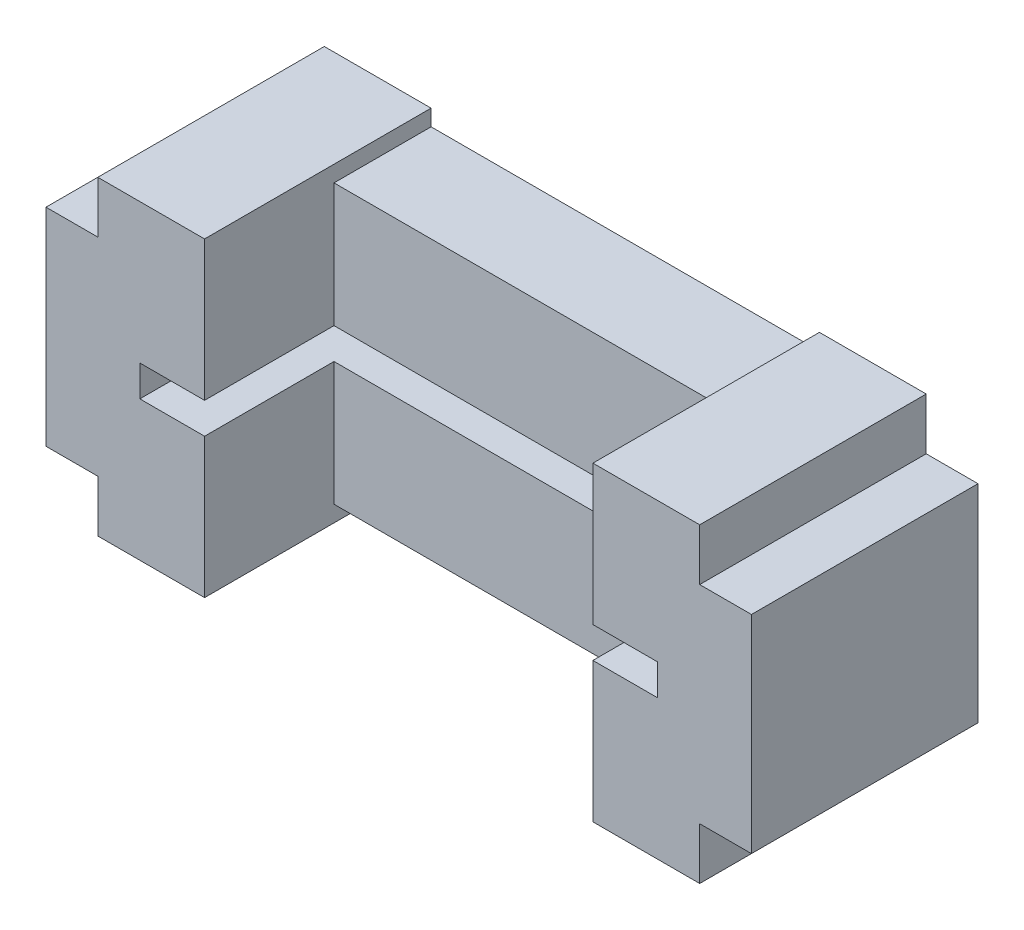
ISO-10303-21;
HEADER;
FILE_DESCRIPTION(('STEP AP214'),'2;1');
FILE_NAME('part.step','',(''),(''),'','','');
FILE_SCHEMA(('AUTOMOTIVE_DESIGN { 1 0 10303 214 1 1 1 1 }'));
ENDSEC;
DATA;
#1=APPLICATION_CONTEXT('core data for automotive mechanical design processes');
#2=APPLICATION_PROTOCOL_DEFINITION('international standard','automotive_design',2000,#1);
#3=PRODUCT_CONTEXT('',#1,'mechanical');
#4=PRODUCT('Part','Part','',(#3));
#5=PRODUCT_RELATED_PRODUCT_CATEGORY('part','',(#4));
#6=PRODUCT_DEFINITION_FORMATION('','',#4);
#7=PRODUCT_DEFINITION_CONTEXT('part definition',#1,'design');
#8=PRODUCT_DEFINITION('design','',#6,#7);
#9=PRODUCT_DEFINITION_SHAPE('','',#8);
#10=(LENGTH_UNIT() NAMED_UNIT(*) SI_UNIT(.MILLI.,.METRE.));
#11=(NAMED_UNIT(*) PLANE_ANGLE_UNIT() SI_UNIT($,.RADIAN.));
#12=(NAMED_UNIT(*) SI_UNIT($,.STERADIAN.) SOLID_ANGLE_UNIT());
#13=UNCERTAINTY_MEASURE_WITH_UNIT(LENGTH_MEASURE(1.E-05),#10,'distance_accuracy_value','');
#14=(GEOMETRIC_REPRESENTATION_CONTEXT(3) GLOBAL_UNCERTAINTY_ASSIGNED_CONTEXT((#13)) GLOBAL_UNIT_ASSIGNED_CONTEXT((#10,
#11,#12)) REPRESENTATION_CONTEXT('',''));
#15=CARTESIAN_POINT('',(0.,0.,0.));
#16=DIRECTION('',(0.,0.,1.));
#17=DIRECTION('',(1.,0.,0.));
#18=AXIS2_PLACEMENT_3D('',#15,#16,#17);
#19=CARTESIAN_POINT('',(-29.5275,-15.24,9.525));
#20=DIRECTION('',(0.,1.,0.));
#21=DIRECTION('',(-1.,0.,0.));
#22=AXIS2_PLACEMENT_3D('',#19,#20,#21);
#23=PLANE('',#22);
#24=DIRECTION('',(1.,0.,0.));
#25=VECTOR('',#24,1.);
#26=CARTESIAN_POINT('',(-29.5275,-15.24,0.));
#27=LINE('',#26,#25);
#28=CARTESIAN_POINT('',(-29.5275,-15.24,0.));
#29=VERTEX_POINT('',#28);
#30=CARTESIAN_POINT('',(-19.05,-15.24,0.));
#31=VERTEX_POINT('',#30);
#32=EDGE_CURVE('E387',#29,#31,#27,.T.);
#33=ORIENTED_EDGE('',*,*,#32,.T.);
#34=DIRECTION('',(0.,0.,-1.));
#35=VECTOR('',#34,1.);
#36=CARTESIAN_POINT('',(-19.05,-15.24,22.225));
#37=LINE('',#36,#35);
#38=CARTESIAN_POINT('',(-19.05,-15.24,22.225));
#39=VERTEX_POINT('',#38);
#40=EDGE_CURVE('E360',#39,#31,#37,.T.);
#41=ORIENTED_EDGE('',*,*,#40,.F.);
#42=DIRECTION('',(1.,0.,0.));
#43=VECTOR('',#42,1.);
#44=CARTESIAN_POINT('',(-29.5275,-15.24,22.225));
#45=LINE('',#44,#43);
#46=CARTESIAN_POINT('',(-29.5275,-15.24,22.225));
#47=VERTEX_POINT('',#46);
#48=EDGE_CURVE('E358',#47,#39,#45,.T.);
#49=ORIENTED_EDGE('',*,*,#48,.F.);
#50=DIRECTION('',(0.,0.,-1.));
#51=VECTOR('',#50,1.);
#52=CARTESIAN_POINT('',(-29.5275,-15.24,9.525));
#53=LINE('',#52,#51);
#54=EDGE_CURVE('E424',#47,#29,#53,.T.);
#55=ORIENTED_EDGE('',*,*,#54,.T.);
#56=EDGE_LOOP('',(#33,#41,#49,#55));
#57=FACE_BOUND('',#56,.T.);
#58=ADVANCED_FACE('F35',(#57),#23,.F.);
#59=CARTESIAN_POINT('',(-29.5275,15.24,9.525));
#60=DIRECTION('',(0.,-1.,0.));
#61=DIRECTION('',(1.,0.,0.));
#62=AXIS2_PLACEMENT_3D('',#59,#60,#61);
#63=PLANE('',#62);
#64=DIRECTION('',(0.,0.,-1.));
#65=VECTOR('',#64,1.);
#66=CARTESIAN_POINT('',(-19.05,15.24,22.225));
#67=LINE('',#66,#65);
#68=CARTESIAN_POINT('',(-19.05,15.24,22.225));
#69=VERTEX_POINT('',#68);
#70=CARTESIAN_POINT('',(-19.05,15.24,0.));
#71=VERTEX_POINT('',#70);
#72=EDGE_CURVE('E364',#69,#71,#67,.T.);
#73=ORIENTED_EDGE('',*,*,#72,.T.);
#74=DIRECTION('',(-1.,0.,0.));
#75=VECTOR('',#74,1.);
#76=CARTESIAN_POINT('',(-29.5275,15.24,0.));
#77=LINE('',#76,#75);
#78=CARTESIAN_POINT('',(-29.5275,15.24,0.));
#79=VERTEX_POINT('',#78);
#80=EDGE_CURVE('E242',#71,#79,#77,.T.);
#81=ORIENTED_EDGE('',*,*,#80,.T.);
#82=DIRECTION('',(0.,0.,-1.));
#83=VECTOR('',#82,1.);
#84=CARTESIAN_POINT('',(-29.5275,15.24,9.525));
#85=LINE('',#84,#83);
#86=CARTESIAN_POINT('',(-29.5275,15.24,22.225));
#87=VERTEX_POINT('',#86);
#88=EDGE_CURVE('E403',#87,#79,#85,.T.);
#89=ORIENTED_EDGE('',*,*,#88,.F.);
#90=DIRECTION('',(-1.,0.,0.));
#91=VECTOR('',#90,1.);
#92=CARTESIAN_POINT('',(-29.5275,15.24,22.225));
#93=LINE('',#92,#91);
#94=EDGE_CURVE('E340',#69,#87,#93,.T.);
#95=ORIENTED_EDGE('',*,*,#94,.F.);
#96=EDGE_LOOP('',(#73,#81,#89,#95));
#97=FACE_BOUND('',#96,.T.);
#98=ADVANCED_FACE('F476',(#97),#63,.F.);
#99=CARTESIAN_POINT('',(0.,0.,9.525));
#100=DIRECTION('',(0.,0.,1.));
#101=DIRECTION('',(1.,0.,0.));
#102=AXIS2_PLACEMENT_3D('',#99,#100,#101);
#103=PLANE('',#102);
#104=DIRECTION('',(1.,0.,0.));
#105=VECTOR('',#104,1.);
#106=CARTESIAN_POINT('',(0.,13.6525,9.525));
#107=LINE('',#106,#105);
#108=CARTESIAN_POINT('',(-19.05,13.6525,9.525));
#109=VERTEX_POINT('',#108);
#110=CARTESIAN_POINT('',(19.05,13.6525,9.525));
#111=VERTEX_POINT('',#110);
#112=EDGE_CURVE('E250',#109,#111,#107,.T.);
#113=ORIENTED_EDGE('',*,*,#112,.F.);
#114=DIRECTION('',(0.,1.,0.));
#115=VECTOR('',#114,1.);
#116=CARTESIAN_POINT('',(-19.05,15.24,9.525));
#117=LINE('',#116,#115);
#118=CARTESIAN_POINT('',(-19.05,1.524,9.525));
#119=VERTEX_POINT('',#118);
#120=EDGE_CURVE('E230',#119,#109,#117,.T.);
#121=ORIENTED_EDGE('',*,*,#120,.F.);
#122=DIRECTION('',(-1.,0.,0.));
#123=VECTOR('',#122,1.);
#124=CARTESIAN_POINT('',(-25.4,1.524,9.525));
#125=LINE('',#124,#123);
#126=CARTESIAN_POINT('',(19.05,1.524,9.525));
#127=VERTEX_POINT('',#126);
#128=EDGE_CURVE('E268',#127,#119,#125,.T.);
#129=ORIENTED_EDGE('',*,*,#128,.F.);
#130=DIRECTION('',(0.,-1.,0.));
#131=VECTOR('',#130,1.);
#132=CARTESIAN_POINT('',(19.05,15.24,9.525));
#133=LINE('',#132,#131);
#134=EDGE_CURVE('E284',#111,#127,#133,.T.);
#135=ORIENTED_EDGE('',*,*,#134,.F.);
#136=EDGE_LOOP('',(#113,#121,#129,#135));
#137=FACE_BOUND('',#136,.T.);
#138=ADVANCED_FACE('F493',(#137),#103,.T.);
#139=DIRECTION('',(-1.,0.,0.));
#140=VECTOR('',#139,1.);
#141=CARTESIAN_POINT('',(0.,-13.6525,9.525));
#142=LINE('',#141,#140);
#143=CARTESIAN_POINT('',(19.05,-13.6525,9.525));
#144=VERTEX_POINT('',#143);
#145=CARTESIAN_POINT('',(-19.05,-13.6525,9.525));
#146=VERTEX_POINT('',#145);
#147=EDGE_CURVE('E261',#144,#146,#142,.T.);
#148=ORIENTED_EDGE('',*,*,#147,.F.);
#149=DIRECTION('',(0.,-1.,0.));
#150=VECTOR('',#149,1.);
#151=CARTESIAN_POINT('',(19.05,-1.524,9.525));
#152=LINE('',#151,#150);
#153=CARTESIAN_POINT('',(19.05,-1.524,9.525));
#154=VERTEX_POINT('',#153);
#155=EDGE_CURVE('E277',#154,#144,#152,.T.);
#156=ORIENTED_EDGE('',*,*,#155,.F.);
#157=DIRECTION('',(1.,0.,0.));
#158=VECTOR('',#157,1.);
#159=CARTESIAN_POINT('',(-25.4,-1.524,9.525));
#160=LINE('',#159,#158);
#161=CARTESIAN_POINT('',(-19.05,-1.524,9.525));
#162=VERTEX_POINT('',#161);
#163=EDGE_CURVE('E263',#162,#154,#160,.T.);
#164=ORIENTED_EDGE('',*,*,#163,.F.);
#165=DIRECTION('',(0.,1.,0.));
#166=VECTOR('',#165,1.);
#167=CARTESIAN_POINT('',(-19.05,-1.524,9.525));
#168=LINE('',#167,#166);
#169=EDGE_CURVE('E329',#146,#162,#168,.T.);
#170=ORIENTED_EDGE('',*,*,#169,.F.);
#171=EDGE_LOOP('',(#148,#156,#164,#170));
#172=FACE_BOUND('',#171,.T.);
#173=ADVANCED_FACE('F486',(#172),#103,.T.);
#174=CARTESIAN_POINT('',(-29.5275,15.24,9.525));
#175=DIRECTION('',(1.,0.,0.));
#176=DIRECTION('',(0.,0.,-1.));
#177=AXIS2_PLACEMENT_3D('',#174,#175,#176);
#178=PLANE('',#177);
#179=DIRECTION('',(0.,-1.,0.));
#180=VECTOR('',#179,1.);
#181=CARTESIAN_POINT('',(-29.5275,15.24,0.));
#182=LINE('',#181,#180);
#183=CARTESIAN_POINT('',(-29.5275,10.16,0.));
#184=VERTEX_POINT('',#183);
#185=EDGE_CURVE('E375',#79,#184,#182,.T.);
#186=ORIENTED_EDGE('',*,*,#185,.T.);
#187=DIRECTION('',(0.,0.,-1.));
#188=VECTOR('',#187,1.);
#189=CARTESIAN_POINT('',(-29.5275,10.16,9.525));
#190=LINE('',#189,#188);
#191=CARTESIAN_POINT('',(-29.5275,10.16,22.225));
#192=VERTEX_POINT('',#191);
#193=EDGE_CURVE('E11',#192,#184,#190,.T.);
#194=ORIENTED_EDGE('',*,*,#193,.F.);
#195=DIRECTION('',(0.,-1.,0.));
#196=VECTOR('',#195,1.);
#197=CARTESIAN_POINT('',(-29.5275,15.24,22.225));
#198=LINE('',#197,#196);
#199=EDGE_CURVE('E343',#87,#192,#198,.T.);
#200=ORIENTED_EDGE('',*,*,#199,.F.);
#201=ORIENTED_EDGE('',*,*,#88,.T.);
#202=EDGE_LOOP('',(#186,#194,#200,#201));
#203=FACE_BOUND('',#202,.T.);
#204=ADVANCED_FACE('F37',(#203),#178,.F.);
#205=CARTESIAN_POINT('',(-34.6075,10.16,9.525));
#206=DIRECTION('',(0.,-1.,0.));
#207=DIRECTION('',(0.,0.,-1.));
#208=AXIS2_PLACEMENT_3D('',#205,#206,#207);
#209=PLANE('',#208);
#210=DIRECTION('',(-1.,0.,0.));
#211=VECTOR('',#210,1.);
#212=CARTESIAN_POINT('',(-34.6075,10.16,0.));
#213=LINE('',#212,#211);
#214=CARTESIAN_POINT('',(-34.6075,10.16,0.));
#215=VERTEX_POINT('',#214);
#216=EDGE_CURVE('E378',#184,#215,#213,.T.);
#217=ORIENTED_EDGE('',*,*,#216,.T.);
#218=DIRECTION('',(0.,0.,-1.));
#219=VECTOR('',#218,1.);
#220=CARTESIAN_POINT('',(-34.6075,10.16,9.525));
#221=LINE('',#220,#219);
#222=CARTESIAN_POINT('',(-34.6075,10.16,22.225));
#223=VERTEX_POINT('',#222);
#224=EDGE_CURVE('E43',#223,#215,#221,.T.);
#225=ORIENTED_EDGE('',*,*,#224,.F.);
#226=DIRECTION('',(-1.,0.,0.));
#227=VECTOR('',#226,1.);
#228=CARTESIAN_POINT('',(-34.6075,10.16,22.225));
#229=LINE('',#228,#227);
#230=EDGE_CURVE('E346',#192,#223,#229,.T.);
#231=ORIENTED_EDGE('',*,*,#230,.F.);
#232=ORIENTED_EDGE('',*,*,#193,.T.);
#233=EDGE_LOOP('',(#217,#225,#231,#232));
#234=FACE_BOUND('',#233,.T.);
#235=ADVANCED_FACE('F479',(#234),#209,.F.);
#236=CARTESIAN_POINT('',(-34.6075,-10.16,9.525));
#237=DIRECTION('',(1.,0.,0.));
#238=DIRECTION('',(0.,1.,0.));
#239=AXIS2_PLACEMENT_3D('',#236,#237,#238);
#240=PLANE('',#239);
#241=DIRECTION('',(0.,-1.,0.));
#242=VECTOR('',#241,1.);
#243=CARTESIAN_POINT('',(-34.6075,-10.16,0.));
#244=LINE('',#243,#242);
#245=CARTESIAN_POINT('',(-34.6075,-10.16,0.));
#246=VERTEX_POINT('',#245);
#247=EDGE_CURVE('E380',#215,#246,#244,.T.);
#248=ORIENTED_EDGE('',*,*,#247,.T.);
#249=DIRECTION('',(0.,0.,-1.));
#250=VECTOR('',#249,1.);
#251=CARTESIAN_POINT('',(-34.6075,-10.16,9.525));
#252=LINE('',#251,#250);
#253=CARTESIAN_POINT('',(-34.6075,-10.16,22.225));
#254=VERTEX_POINT('',#253);
#255=EDGE_CURVE('E430',#254,#246,#252,.T.);
#256=ORIENTED_EDGE('',*,*,#255,.F.);
#257=DIRECTION('',(0.,-1.,0.));
#258=VECTOR('',#257,1.);
#259=CARTESIAN_POINT('',(-34.6075,10.16,22.225));
#260=LINE('',#259,#258);
#261=EDGE_CURVE('E349',#223,#254,#260,.T.);
#262=ORIENTED_EDGE('',*,*,#261,.F.);
#263=ORIENTED_EDGE('',*,*,#224,.T.);
#264=EDGE_LOOP('',(#248,#256,#262,#263));
#265=FACE_BOUND('',#264,.T.);
#266=ADVANCED_FACE('F436',(#265),#240,.F.);
#267=CARTESIAN_POINT('',(-34.6075,-10.16,9.525));
#268=DIRECTION('',(0.,1.,0.));
#269=DIRECTION('',(0.,0.,1.));
#270=AXIS2_PLACEMENT_3D('',#267,#268,#269);
#271=PLANE('',#270);
#272=DIRECTION('',(1.,0.,0.));
#273=VECTOR('',#272,1.);
#274=CARTESIAN_POINT('',(-34.6075,-10.16,0.));
#275=LINE('',#274,#273);
#276=CARTESIAN_POINT('',(-29.5275,-10.16,0.));
#277=VERTEX_POINT('',#276);
#278=EDGE_CURVE('E382',#246,#277,#275,.T.);
#279=ORIENTED_EDGE('',*,*,#278,.T.);
#280=DIRECTION('',(0.,0.,-1.));
#281=VECTOR('',#280,1.);
#282=CARTESIAN_POINT('',(-29.5275,-10.16,9.525));
#283=LINE('',#282,#281);
#284=CARTESIAN_POINT('',(-29.5275,-10.16,22.225));
#285=VERTEX_POINT('',#284);
#286=EDGE_CURVE('E427',#285,#277,#283,.T.);
#287=ORIENTED_EDGE('',*,*,#286,.F.);
#288=DIRECTION('',(1.,0.,0.));
#289=VECTOR('',#288,1.);
#290=CARTESIAN_POINT('',(-29.5275,-10.16,22.225));
#291=LINE('',#290,#289);
#292=EDGE_CURVE('E352',#254,#285,#291,.T.);
#293=ORIENTED_EDGE('',*,*,#292,.F.);
#294=ORIENTED_EDGE('',*,*,#255,.T.);
#295=EDGE_LOOP('',(#279,#287,#293,#294));
#296=FACE_BOUND('',#295,.T.);
#297=ADVANCED_FACE('F443',(#296),#271,.F.);
#298=CARTESIAN_POINT('',(-29.5275,-15.24,9.525));
#299=DIRECTION('',(1.,0.,0.));
#300=DIRECTION('',(0.,0.,-1.));
#301=AXIS2_PLACEMENT_3D('',#298,#299,#300);
#302=PLANE('',#301);
#303=DIRECTION('',(0.,-1.,0.));
#304=VECTOR('',#303,1.);
#305=CARTESIAN_POINT('',(-29.5275,-15.24,0.));
#306=LINE('',#305,#304);
#307=EDGE_CURVE('E384',#277,#29,#306,.T.);
#308=ORIENTED_EDGE('',*,*,#307,.T.);
#309=ORIENTED_EDGE('',*,*,#54,.F.);
#310=DIRECTION('',(0.,-1.,0.));
#311=VECTOR('',#310,1.);
#312=CARTESIAN_POINT('',(-29.5275,-10.16,22.225));
#313=LINE('',#312,#311);
#314=EDGE_CURVE('E355',#285,#47,#313,.T.);
#315=ORIENTED_EDGE('',*,*,#314,.F.);
#316=ORIENTED_EDGE('',*,*,#286,.T.);
#317=EDGE_LOOP('',(#308,#309,#315,#316));
#318=FACE_BOUND('',#317,.T.);
#319=ADVANCED_FACE('F447',(#318),#302,.F.);
#320=DIRECTION('',(0.,0.,-1.));
#321=VECTOR('',#320,1.);
#322=CARTESIAN_POINT('',(19.05,-15.24,22.225));
#323=LINE('',#322,#321);
#324=CARTESIAN_POINT('',(19.05,-15.24,22.225));
#325=VERTEX_POINT('',#324);
#326=CARTESIAN_POINT('',(19.05,-15.24,0.));
#327=VERTEX_POINT('',#326);
#328=EDGE_CURVE('E324',#325,#327,#323,.T.);
#329=ORIENTED_EDGE('',*,*,#328,.T.);
#330=CARTESIAN_POINT('',(29.5275,-15.24,0.));
#331=VERTEX_POINT('',#330);
#332=EDGE_CURVE('E386',#327,#331,#27,.T.);
#333=ORIENTED_EDGE('',*,*,#332,.T.);
#334=DIRECTION('',(0.,0.,-1.));
#335=VECTOR('',#334,1.);
#336=CARTESIAN_POINT('',(29.5275,-15.24,9.525));
#337=LINE('',#336,#335);
#338=CARTESIAN_POINT('',(29.5275,-15.24,22.225));
#339=VERTEX_POINT('',#338);
#340=EDGE_CURVE('E421',#339,#331,#337,.T.);
#341=ORIENTED_EDGE('',*,*,#340,.F.);
#342=DIRECTION('',(1.,0.,0.));
#343=VECTOR('',#342,1.);
#344=CARTESIAN_POINT('',(29.5275,-15.24,22.225));
#345=LINE('',#344,#343);
#346=EDGE_CURVE('E286',#325,#339,#345,.T.);
#347=ORIENTED_EDGE('',*,*,#346,.F.);
#348=EDGE_LOOP('',(#329,#333,#341,#347));
#349=FACE_BOUND('',#348,.T.);
#350=ADVANCED_FACE('F489',(#349),#23,.F.);
#351=CARTESIAN_POINT('',(29.5275,-15.24,9.525));
#352=DIRECTION('',(-1.,0.,0.));
#353=DIRECTION('',(0.,0.,1.));
#354=AXIS2_PLACEMENT_3D('',#351,#352,#353);
#355=PLANE('',#354);
#356=DIRECTION('',(0.,1.,0.));
#357=VECTOR('',#356,1.);
#358=CARTESIAN_POINT('',(29.5275,-15.24,0.));
#359=LINE('',#358,#357);
#360=CARTESIAN_POINT('',(29.5275,-10.16,0.));
#361=VERTEX_POINT('',#360);
#362=EDGE_CURVE('E390',#331,#361,#359,.T.);
#363=ORIENTED_EDGE('',*,*,#362,.T.);
#364=DIRECTION('',(0.,0.,-1.));
#365=VECTOR('',#364,1.);
#366=CARTESIAN_POINT('',(29.5275,-10.16,9.525));
#367=LINE('',#366,#365);
#368=CARTESIAN_POINT('',(29.5275,-10.16,22.225));
#369=VERTEX_POINT('',#368);
#370=EDGE_CURVE('E418',#369,#361,#367,.T.);
#371=ORIENTED_EDGE('',*,*,#370,.F.);
#372=DIRECTION('',(0.,1.,0.));
#373=VECTOR('',#372,1.);
#374=CARTESIAN_POINT('',(29.5275,-15.24,22.225));
#375=LINE('',#374,#373);
#376=EDGE_CURVE('E289',#339,#369,#375,.T.);
#377=ORIENTED_EDGE('',*,*,#376,.F.);
#378=ORIENTED_EDGE('',*,*,#340,.T.);
#379=EDGE_LOOP('',(#363,#371,#377,#378));
#380=FACE_BOUND('',#379,.T.);
#381=ADVANCED_FACE('F499',(#380),#355,.F.);
#382=CARTESIAN_POINT('',(34.6075,-10.16,9.525));
#383=DIRECTION('',(0.,1.,0.));
#384=DIRECTION('',(0.,0.,1.));
#385=AXIS2_PLACEMENT_3D('',#382,#383,#384);
#386=PLANE('',#385);
#387=DIRECTION('',(1.,0.,0.));
#388=VECTOR('',#387,1.);
#389=CARTESIAN_POINT('',(34.6075,-10.16,0.));
#390=LINE('',#389,#388);
#391=CARTESIAN_POINT('',(34.6075,-10.16,0.));
#392=VERTEX_POINT('',#391);
#393=EDGE_CURVE('E392',#361,#392,#390,.T.);
#394=ORIENTED_EDGE('',*,*,#393,.T.);
#395=DIRECTION('',(0.,0.,-1.));
#396=VECTOR('',#395,1.);
#397=CARTESIAN_POINT('',(34.6075,-10.16,9.525));
#398=LINE('',#397,#396);
#399=CARTESIAN_POINT('',(34.6075,-10.16,22.225));
#400=VERTEX_POINT('',#399);
#401=EDGE_CURVE('E415',#400,#392,#398,.T.);
#402=ORIENTED_EDGE('',*,*,#401,.F.);
#403=DIRECTION('',(1.,0.,0.));
#404=VECTOR('',#403,1.);
#405=CARTESIAN_POINT('',(34.6075,-10.16,22.225));
#406=LINE('',#405,#404);
#407=EDGE_CURVE('E292',#369,#400,#406,.T.);
#408=ORIENTED_EDGE('',*,*,#407,.F.);
#409=ORIENTED_EDGE('',*,*,#370,.T.);
#410=EDGE_LOOP('',(#394,#402,#408,#409));
#411=FACE_BOUND('',#410,.T.);
#412=ADVANCED_FACE('F505',(#411),#386,.F.);
#413=CARTESIAN_POINT('',(34.6075,-10.16,9.525));
#414=DIRECTION('',(-1.,0.,0.));
#415=DIRECTION('',(0.,-1.,0.));
#416=AXIS2_PLACEMENT_3D('',#413,#414,#415);
#417=PLANE('',#416);
#418=DIRECTION('',(0.,1.,0.));
#419=VECTOR('',#418,1.);
#420=CARTESIAN_POINT('',(34.6075,-10.16,0.));
#421=LINE('',#420,#419);
#422=CARTESIAN_POINT('',(34.6075,10.16,0.));
#423=VERTEX_POINT('',#422);
#424=EDGE_CURVE('E394',#392,#423,#421,.T.);
#425=ORIENTED_EDGE('',*,*,#424,.T.);
#426=DIRECTION('',(0.,0.,-1.));
#427=VECTOR('',#426,1.);
#428=CARTESIAN_POINT('',(34.6075,10.16,9.525));
#429=LINE('',#428,#427);
#430=CARTESIAN_POINT('',(34.6075,10.16,22.225));
#431=VERTEX_POINT('',#430);
#432=EDGE_CURVE('E412',#431,#423,#429,.T.);
#433=ORIENTED_EDGE('',*,*,#432,.F.);
#434=DIRECTION('',(0.,1.,0.));
#435=VECTOR('',#434,1.);
#436=CARTESIAN_POINT('',(34.6075,10.16,22.225));
#437=LINE('',#436,#435);
#438=EDGE_CURVE('E295',#400,#431,#437,.T.);
#439=ORIENTED_EDGE('',*,*,#438,.F.);
#440=ORIENTED_EDGE('',*,*,#401,.T.);
#441=EDGE_LOOP('',(#425,#433,#439,#440));
#442=FACE_BOUND('',#441,.T.);
#443=ADVANCED_FACE('F524',(#442),#417,.F.);
#444=CARTESIAN_POINT('',(34.6075,10.16,9.525));
#445=DIRECTION('',(0.,-1.,0.));
#446=DIRECTION('',(0.,0.,-1.));
#447=AXIS2_PLACEMENT_3D('',#444,#445,#446);
#448=PLANE('',#447);
#449=DIRECTION('',(-1.,0.,0.));
#450=VECTOR('',#449,1.);
#451=CARTESIAN_POINT('',(34.6075,10.16,0.));
#452=LINE('',#451,#450);
#453=CARTESIAN_POINT('',(29.5275,10.16,0.));
#454=VERTEX_POINT('',#453);
#455=EDGE_CURVE('E396',#423,#454,#452,.T.);
#456=ORIENTED_EDGE('',*,*,#455,.T.);
#457=DIRECTION('',(0.,0.,-1.));
#458=VECTOR('',#457,1.);
#459=CARTESIAN_POINT('',(29.5275,10.16,9.525));
#460=LINE('',#459,#458);
#461=CARTESIAN_POINT('',(29.5275,10.16,22.225));
#462=VERTEX_POINT('',#461);
#463=EDGE_CURVE('E409',#462,#454,#460,.T.);
#464=ORIENTED_EDGE('',*,*,#463,.F.);
#465=DIRECTION('',(-1.,0.,0.));
#466=VECTOR('',#465,1.);
#467=CARTESIAN_POINT('',(34.6075,10.16,22.225));
#468=LINE('',#467,#466);
#469=EDGE_CURVE('E298',#431,#462,#468,.T.);
#470=ORIENTED_EDGE('',*,*,#469,.F.);
#471=ORIENTED_EDGE('',*,*,#432,.T.);
#472=EDGE_LOOP('',(#456,#464,#470,#471));
#473=FACE_BOUND('',#472,.T.);
#474=ADVANCED_FACE('F527',(#473),#448,.F.);
#475=CARTESIAN_POINT('',(29.5275,15.24,9.525));
#476=DIRECTION('',(-1.,0.,0.));
#477=DIRECTION('',(0.,0.,1.));
#478=AXIS2_PLACEMENT_3D('',#475,#476,#477);
#479=PLANE('',#478);
#480=DIRECTION('',(0.,1.,0.));
#481=VECTOR('',#480,1.);
#482=CARTESIAN_POINT('',(29.5275,15.24,0.));
#483=LINE('',#482,#481);
#484=CARTESIAN_POINT('',(29.5275,15.24,0.));
#485=VERTEX_POINT('',#484);
#486=EDGE_CURVE('E398',#454,#485,#483,.T.);
#487=ORIENTED_EDGE('',*,*,#486,.T.);
#488=DIRECTION('',(0.,0.,-1.));
#489=VECTOR('',#488,1.);
#490=CARTESIAN_POINT('',(29.5275,15.24,9.525));
#491=LINE('',#490,#489);
#492=CARTESIAN_POINT('',(29.5275,15.24,22.225));
#493=VERTEX_POINT('',#492);
#494=EDGE_CURVE('E406',#493,#485,#491,.T.);
#495=ORIENTED_EDGE('',*,*,#494,.F.);
#496=DIRECTION('',(0.,1.,0.));
#497=VECTOR('',#496,1.);
#498=CARTESIAN_POINT('',(29.5275,15.24,22.225));
#499=LINE('',#498,#497);
#500=EDGE_CURVE('E301',#462,#493,#499,.T.);
#501=ORIENTED_EDGE('',*,*,#500,.F.);
#502=ORIENTED_EDGE('',*,*,#463,.T.);
#503=EDGE_LOOP('',(#487,#495,#501,#502));
#504=FACE_BOUND('',#503,.T.);
#505=ADVANCED_FACE('F531',(#504),#479,.F.);
#506=CARTESIAN_POINT('',(19.05,15.24,0.));
#507=VERTEX_POINT('',#506);
#508=EDGE_CURVE('E400',#485,#507,#77,.T.);
#509=ORIENTED_EDGE('',*,*,#508,.T.);
#510=DIRECTION('',(0.,0.,-1.));
#511=VECTOR('',#510,1.);
#512=CARTESIAN_POINT('',(19.05,15.24,22.225));
#513=LINE('',#512,#511);
#514=CARTESIAN_POINT('',(19.05,15.24,22.225));
#515=VERTEX_POINT('',#514);
#516=EDGE_CURVE('E322',#515,#507,#513,.T.);
#517=ORIENTED_EDGE('',*,*,#516,.F.);
#518=DIRECTION('',(-1.,0.,0.));
#519=VECTOR('',#518,1.);
#520=CARTESIAN_POINT('',(29.5275,15.24,22.225));
#521=LINE('',#520,#519);
#522=EDGE_CURVE('E304',#493,#515,#521,.T.);
#523=ORIENTED_EDGE('',*,*,#522,.F.);
#524=ORIENTED_EDGE('',*,*,#494,.T.);
#525=EDGE_LOOP('',(#509,#517,#523,#524));
#526=FACE_BOUND('',#525,.T.);
#527=ADVANCED_FACE('F495',(#526),#63,.F.);
#528=CARTESIAN_POINT('',(0.,0.,0.));
#529=DIRECTION('',(0.,0.,1.));
#530=DIRECTION('',(1.,0.,0.));
#531=AXIS2_PLACEMENT_3D('',#528,#529,#530);
#532=PLANE('',#531);
#533=ORIENTED_EDGE('',*,*,#80,.F.);
#534=DIRECTION('',(0.,-1.,0.));
#535=VECTOR('',#534,1.);
#536=CARTESIAN_POINT('',(-19.05,15.24,0.));
#537=LINE('',#536,#535);
#538=CARTESIAN_POINT('',(-19.05,13.6525,0.));
#539=VERTEX_POINT('',#538);
#540=EDGE_CURVE('E226',#71,#539,#537,.T.);
#541=ORIENTED_EDGE('',*,*,#540,.T.);
#542=DIRECTION('',(1.,0.,0.));
#543=VECTOR('',#542,1.);
#544=CARTESIAN_POINT('',(-19.05,13.6525,0.));
#545=LINE('',#544,#543);
#546=CARTESIAN_POINT('',(19.05,13.6525,0.));
#547=VERTEX_POINT('',#546);
#548=EDGE_CURVE('E236',#539,#547,#545,.T.);
#549=ORIENTED_EDGE('',*,*,#548,.T.);
#550=DIRECTION('',(0.,1.,0.));
#551=VECTOR('',#550,1.);
#552=CARTESIAN_POINT('',(19.05,15.24,0.));
#553=LINE('',#552,#551);
#554=EDGE_CURVE('E50',#547,#507,#553,.T.);
#555=ORIENTED_EDGE('',*,*,#554,.T.);
#556=ORIENTED_EDGE('',*,*,#508,.F.);
#557=ORIENTED_EDGE('',*,*,#486,.F.);
#558=ORIENTED_EDGE('',*,*,#455,.F.);
#559=ORIENTED_EDGE('',*,*,#424,.F.);
#560=ORIENTED_EDGE('',*,*,#393,.F.);
#561=ORIENTED_EDGE('',*,*,#362,.F.);
#562=ORIENTED_EDGE('',*,*,#332,.F.);
#563=DIRECTION('',(0.,1.,0.));
#564=VECTOR('',#563,1.);
#565=CARTESIAN_POINT('',(19.05,-15.24,0.));
#566=LINE('',#565,#564);
#567=CARTESIAN_POINT('',(19.05,-13.6525,0.));
#568=VERTEX_POINT('',#567);
#569=EDGE_CURVE('E252',#327,#568,#566,.T.);
#570=ORIENTED_EDGE('',*,*,#569,.T.);
#571=DIRECTION('',(-1.,0.,0.));
#572=VECTOR('',#571,1.);
#573=CARTESIAN_POINT('',(-19.05,-13.6525,0.));
#574=LINE('',#573,#572);
#575=CARTESIAN_POINT('',(-19.05,-13.6525,0.));
#576=VERTEX_POINT('',#575);
#577=EDGE_CURVE('E58',#568,#576,#574,.T.);
#578=ORIENTED_EDGE('',*,*,#577,.T.);
#579=DIRECTION('',(0.,-1.,0.));
#580=VECTOR('',#579,1.);
#581=CARTESIAN_POINT('',(-19.05,-15.24,0.));
#582=LINE('',#581,#580);
#583=EDGE_CURVE('E256',#576,#31,#582,.T.);
#584=ORIENTED_EDGE('',*,*,#583,.T.);
#585=ORIENTED_EDGE('',*,*,#32,.F.);
#586=ORIENTED_EDGE('',*,*,#307,.F.);
#587=ORIENTED_EDGE('',*,*,#278,.F.);
#588=ORIENTED_EDGE('',*,*,#247,.F.);
#589=ORIENTED_EDGE('',*,*,#216,.F.);
#590=ORIENTED_EDGE('',*,*,#185,.F.);
#591=EDGE_LOOP('',(#533,#541,#549,#555,#556,#557,#558,#559,#560,#561,#562,#570,#578,#584,#585,
#586,#587,#588,#589,#590));
#592=FACE_BOUND('',#591,.T.);
#593=ADVANCED_FACE('F240',(#592),#532,.F.);
#594=CARTESIAN_POINT('',(-19.05,-1.524,22.225));
#595=DIRECTION('',(-1.,0.,0.));
#596=DIRECTION('',(0.,-1.,0.));
#597=AXIS2_PLACEMENT_3D('',#594,#595,#596);
#598=PLANE('',#597);
#599=DIRECTION('',(0.,0.,-1.));
#600=VECTOR('',#599,1.);
#601=CARTESIAN_POINT('',(-19.05,-1.524,22.225));
#602=LINE('',#601,#600);
#603=CARTESIAN_POINT('',(-19.05,-1.524,22.225));
#604=VERTEX_POINT('',#603);
#605=EDGE_CURVE('E372',#604,#162,#602,.T.);
#606=ORIENTED_EDGE('',*,*,#605,.F.);
#607=DIRECTION('',(0.,1.,0.));
#608=VECTOR('',#607,1.);
#609=CARTESIAN_POINT('',(-19.05,-1.524,22.225));
#610=LINE('',#609,#608);
#611=EDGE_CURVE('E330',#39,#604,#610,.T.);
#612=ORIENTED_EDGE('',*,*,#611,.F.);
#613=ORIENTED_EDGE('',*,*,#40,.T.);
#614=ORIENTED_EDGE('',*,*,#583,.F.);
#615=DIRECTION('',(0.,0.,1.));
#616=VECTOR('',#615,1.);
#617=CARTESIAN_POINT('',(-19.05,-13.6525,0.));
#618=LINE('',#617,#616);
#619=EDGE_CURVE('E243',#576,#146,#618,.T.);
#620=ORIENTED_EDGE('',*,*,#619,.T.);
#621=ORIENTED_EDGE('',*,*,#169,.T.);
#622=EDGE_LOOP('',(#606,#612,#613,#614,#620,#621));
#623=FACE_BOUND('',#622,.T.);
#624=ADVANCED_FACE('F457',(#623),#598,.F.);
#625=CARTESIAN_POINT('',(-19.05,-1.524,22.225));
#626=DIRECTION('',(0.,-1.,0.));
#627=DIRECTION('',(1.,0.,0.));
#628=AXIS2_PLACEMENT_3D('',#625,#626,#627);
#629=PLANE('',#628);
#630=ORIENTED_EDGE('',*,*,#605,.T.);
#631=ORIENTED_EDGE('',*,*,#163,.T.);
#632=DIRECTION('',(0.,0.,-1.));
#633=VECTOR('',#632,1.);
#634=CARTESIAN_POINT('',(19.05,-1.524,22.225));
#635=LINE('',#634,#633);
#636=CARTESIAN_POINT('',(19.05,-1.524,22.225));
#637=VERTEX_POINT('',#636);
#638=EDGE_CURVE('E326',#637,#154,#635,.T.);
#639=ORIENTED_EDGE('',*,*,#638,.F.);
#640=DIRECTION('',(-1.,0.,0.));
#641=VECTOR('',#640,1.);
#642=CARTESIAN_POINT('',(19.05,-1.524,22.225));
#643=LINE('',#642,#641);
#644=CARTESIAN_POINT('',(25.4,-1.524,22.225));
#645=VERTEX_POINT('',#644);
#646=EDGE_CURVE('E280',#645,#637,#643,.T.);
#647=ORIENTED_EDGE('',*,*,#646,.F.);
#648=DIRECTION('',(0.,0.,-1.));
#649=VECTOR('',#648,1.);
#650=CARTESIAN_POINT('',(25.4,-1.524,22.225));
#651=LINE('',#650,#649);
#652=CARTESIAN_POINT('',(25.4,-1.524,3.429));
#653=VERTEX_POINT('',#652);
#654=EDGE_CURVE('E312',#645,#653,#651,.T.);
#655=ORIENTED_EDGE('',*,*,#654,.T.);
#656=DIRECTION('',(1.,0.,0.));
#657=VECTOR('',#656,1.);
#658=CARTESIAN_POINT('',(-25.4,-1.524,3.429));
#659=LINE('',#658,#657);
#660=CARTESIAN_POINT('',(-25.4,-1.524,3.429));
#661=VERTEX_POINT('',#660);
#662=EDGE_CURVE('E267',#661,#653,#659,.T.);
#663=ORIENTED_EDGE('',*,*,#662,.F.);
#664=DIRECTION('',(0.,0.,-1.));
#665=VECTOR('',#664,1.);
#666=CARTESIAN_POINT('',(-25.4,-1.524,22.225));
#667=LINE('',#666,#665);
#668=CARTESIAN_POINT('',(-25.4,-1.524,22.225));
#669=VERTEX_POINT('',#668);
#670=EDGE_CURVE('E370',#669,#661,#667,.T.);
#671=ORIENTED_EDGE('',*,*,#670,.F.);
#672=DIRECTION('',(-1.,0.,0.));
#673=VECTOR('',#672,1.);
#674=CARTESIAN_POINT('',(-19.05,-1.524,22.225));
#675=LINE('',#674,#673);
#676=EDGE_CURVE('E332',#604,#669,#675,.T.);
#677=ORIENTED_EDGE('',*,*,#676,.F.);
#678=EDGE_LOOP('',(#630,#631,#639,#647,#655,#663,#671,#677));
#679=FACE_BOUND('',#678,.T.);
#680=ADVANCED_FACE('F461',(#679),#629,.F.);
#681=CARTESIAN_POINT('',(-25.4,1.524,22.225));
#682=DIRECTION('',(-1.,0.,0.));
#683=DIRECTION('',(0.,0.,1.));
#684=AXIS2_PLACEMENT_3D('',#681,#682,#683);
#685=PLANE('',#684);
#686=ORIENTED_EDGE('',*,*,#670,.T.);
#687=DIRECTION('',(0.,-1.,0.));
#688=VECTOR('',#687,1.);
#689=CARTESIAN_POINT('',(-25.4,-1.524,3.429));
#690=LINE('',#689,#688);
#691=CARTESIAN_POINT('',(-25.4,1.524,3.429));
#692=VERTEX_POINT('',#691);
#693=EDGE_CURVE('E264',#692,#661,#690,.T.);
#694=ORIENTED_EDGE('',*,*,#693,.F.);
#695=DIRECTION('',(0.,0.,-1.));
#696=VECTOR('',#695,1.);
#697=CARTESIAN_POINT('',(-25.4,1.524,22.225));
#698=LINE('',#697,#696);
#699=CARTESIAN_POINT('',(-25.4,1.524,22.225));
#700=VERTEX_POINT('',#699);
#701=EDGE_CURVE('E368',#700,#692,#698,.T.);
#702=ORIENTED_EDGE('',*,*,#701,.F.);
#703=DIRECTION('',(0.,1.,0.));
#704=VECTOR('',#703,1.);
#705=CARTESIAN_POINT('',(-25.4,1.524,22.225));
#706=LINE('',#705,#704);
#707=EDGE_CURVE('E334',#669,#700,#706,.T.);
#708=ORIENTED_EDGE('',*,*,#707,.F.);
#709=EDGE_LOOP('',(#686,#694,#702,#708));
#710=FACE_BOUND('',#709,.T.);
#711=ADVANCED_FACE('F467',(#710),#685,.F.);
#712=CARTESIAN_POINT('',(-19.05,1.524,22.225));
#713=DIRECTION('',(0.,1.,0.));
#714=DIRECTION('',(-1.,0.,0.));
#715=AXIS2_PLACEMENT_3D('',#712,#713,#714);
#716=PLANE('',#715);
#717=ORIENTED_EDGE('',*,*,#701,.T.);
#718=DIRECTION('',(-1.,0.,0.));
#719=VECTOR('',#718,1.);
#720=CARTESIAN_POINT('',(-25.4,1.524,3.429));
#721=LINE('',#720,#719);
#722=CARTESIAN_POINT('',(25.4,1.524,3.429));
#723=VERTEX_POINT('',#722);
#724=EDGE_CURVE('E274',#723,#692,#721,.T.);
#725=ORIENTED_EDGE('',*,*,#724,.F.);
#726=DIRECTION('',(0.,0.,-1.));
#727=VECTOR('',#726,1.);
#728=CARTESIAN_POINT('',(25.4,1.524,22.225));
#729=LINE('',#728,#727);
#730=CARTESIAN_POINT('',(25.4,1.524,22.225));
#731=VERTEX_POINT('',#730);
#732=EDGE_CURVE('E317',#731,#723,#729,.T.);
#733=ORIENTED_EDGE('',*,*,#732,.F.);
#734=DIRECTION('',(1.,0.,0.));
#735=VECTOR('',#734,1.);
#736=CARTESIAN_POINT('',(19.05,1.524,22.225));
#737=LINE('',#736,#735);
#738=CARTESIAN_POINT('',(19.05,1.524,22.225));
#739=VERTEX_POINT('',#738);
#740=EDGE_CURVE('E308',#739,#731,#737,.T.);
#741=ORIENTED_EDGE('',*,*,#740,.F.);
#742=DIRECTION('',(0.,0.,-1.));
#743=VECTOR('',#742,1.);
#744=CARTESIAN_POINT('',(19.05,1.524,22.225));
#745=LINE('',#744,#743);
#746=EDGE_CURVE('E319',#739,#127,#745,.T.);
#747=ORIENTED_EDGE('',*,*,#746,.T.);
#748=ORIENTED_EDGE('',*,*,#128,.T.);
#749=DIRECTION('',(0.,0.,-1.));
#750=VECTOR('',#749,1.);
#751=CARTESIAN_POINT('',(-19.05,1.524,22.225));
#752=LINE('',#751,#750);
#753=CARTESIAN_POINT('',(-19.05,1.524,22.225));
#754=VERTEX_POINT('',#753);
#755=EDGE_CURVE('E366',#754,#119,#752,.T.);
#756=ORIENTED_EDGE('',*,*,#755,.F.);
#757=DIRECTION('',(1.,0.,0.));
#758=VECTOR('',#757,1.);
#759=CARTESIAN_POINT('',(-19.05,1.524,22.225));
#760=LINE('',#759,#758);
#761=EDGE_CURVE('E336',#700,#754,#760,.T.);
#762=ORIENTED_EDGE('',*,*,#761,.F.);
#763=EDGE_LOOP('',(#717,#725,#733,#741,#747,#748,#756,#762));
#764=FACE_BOUND('',#763,.T.);
#765=ADVANCED_FACE('F472',(#764),#716,.F.);
#766=CARTESIAN_POINT('',(-19.05,15.24,22.225));
#767=DIRECTION('',(-1.,0.,0.));
#768=DIRECTION('',(0.,-1.,0.));
#769=AXIS2_PLACEMENT_3D('',#766,#767,#768);
#770=PLANE('',#769);
#771=ORIENTED_EDGE('',*,*,#120,.T.);
#772=DIRECTION('',(0.,0.,1.));
#773=VECTOR('',#772,1.);
#774=CARTESIAN_POINT('',(-19.05,13.6525,0.));
#775=LINE('',#774,#773);
#776=EDGE_CURVE('E221',#539,#109,#775,.T.);
#777=ORIENTED_EDGE('',*,*,#776,.F.);
#778=ORIENTED_EDGE('',*,*,#540,.F.);
#779=ORIENTED_EDGE('',*,*,#72,.F.);
#780=DIRECTION('',(0.,1.,0.));
#781=VECTOR('',#780,1.);
#782=CARTESIAN_POINT('',(-19.05,15.24,22.225));
#783=LINE('',#782,#781);
#784=EDGE_CURVE('E338',#754,#69,#783,.T.);
#785=ORIENTED_EDGE('',*,*,#784,.F.);
#786=ORIENTED_EDGE('',*,*,#755,.T.);
#787=EDGE_LOOP('',(#771,#777,#778,#779,#785,#786));
#788=FACE_BOUND('',#787,.T.);
#789=ADVANCED_FACE('F223',(#788),#770,.F.);
#790=CARTESIAN_POINT('',(0.,0.,22.225));
#791=DIRECTION('',(0.,0.,1.));
#792=DIRECTION('',(1.,0.,0.));
#793=AXIS2_PLACEMENT_3D('',#790,#791,#792);
#794=PLANE('',#793);
#795=ORIENTED_EDGE('',*,*,#611,.T.);
#796=ORIENTED_EDGE('',*,*,#676,.T.);
#797=ORIENTED_EDGE('',*,*,#707,.T.);
#798=ORIENTED_EDGE('',*,*,#761,.T.);
#799=ORIENTED_EDGE('',*,*,#784,.T.);
#800=ORIENTED_EDGE('',*,*,#94,.T.);
#801=ORIENTED_EDGE('',*,*,#199,.T.);
#802=ORIENTED_EDGE('',*,*,#230,.T.);
#803=ORIENTED_EDGE('',*,*,#261,.T.);
#804=ORIENTED_EDGE('',*,*,#292,.T.);
#805=ORIENTED_EDGE('',*,*,#314,.T.);
#806=ORIENTED_EDGE('',*,*,#48,.T.);
#807=EDGE_LOOP('',(#795,#796,#797,#798,#799,#800,#801,#802,#803,#804,#805,#806));
#808=FACE_BOUND('',#807,.T.);
#809=ADVANCED_FACE('F450',(#808),#794,.T.);
#810=CARTESIAN_POINT('',(19.05,-1.524,22.225));
#811=DIRECTION('',(1.,0.,0.));
#812=DIRECTION('',(0.,1.,0.));
#813=AXIS2_PLACEMENT_3D('',#810,#811,#812);
#814=PLANE('',#813);
#815=ORIENTED_EDGE('',*,*,#155,.T.);
#816=DIRECTION('',(0.,0.,1.));
#817=VECTOR('',#816,1.);
#818=CARTESIAN_POINT('',(19.05,-13.6525,0.));
#819=LINE('',#818,#817);
#820=EDGE_CURVE('E246',#568,#144,#819,.T.);
#821=ORIENTED_EDGE('',*,*,#820,.F.);
#822=ORIENTED_EDGE('',*,*,#569,.F.);
#823=ORIENTED_EDGE('',*,*,#328,.F.);
#824=DIRECTION('',(0.,-1.,0.));
#825=VECTOR('',#824,1.);
#826=CARTESIAN_POINT('',(19.05,-1.524,22.225));
#827=LINE('',#826,#825);
#828=EDGE_CURVE('E283',#637,#325,#827,.T.);
#829=ORIENTED_EDGE('',*,*,#828,.F.);
#830=ORIENTED_EDGE('',*,*,#638,.T.);
#831=EDGE_LOOP('',(#815,#821,#822,#823,#829,#830));
#832=FACE_BOUND('',#831,.T.);
#833=ADVANCED_FACE('F512',(#832),#814,.F.);
#834=CARTESIAN_POINT('',(19.05,15.24,22.225));
#835=DIRECTION('',(1.,0.,0.));
#836=DIRECTION('',(0.,1.,0.));
#837=AXIS2_PLACEMENT_3D('',#834,#835,#836);
#838=PLANE('',#837);
#839=ORIENTED_EDGE('',*,*,#746,.F.);
#840=DIRECTION('',(0.,-1.,0.));
#841=VECTOR('',#840,1.);
#842=CARTESIAN_POINT('',(19.05,15.24,22.225));
#843=LINE('',#842,#841);
#844=EDGE_CURVE('E306',#515,#739,#843,.T.);
#845=ORIENTED_EDGE('',*,*,#844,.F.);
#846=ORIENTED_EDGE('',*,*,#516,.T.);
#847=ORIENTED_EDGE('',*,*,#554,.F.);
#848=DIRECTION('',(0.,0.,1.));
#849=VECTOR('',#848,1.);
#850=CARTESIAN_POINT('',(19.05,13.6525,0.));
#851=LINE('',#850,#849);
#852=EDGE_CURVE('E233',#547,#111,#851,.T.);
#853=ORIENTED_EDGE('',*,*,#852,.T.);
#854=ORIENTED_EDGE('',*,*,#134,.T.);
#855=EDGE_LOOP('',(#839,#845,#846,#847,#853,#854));
#856=FACE_BOUND('',#855,.T.);
#857=ADVANCED_FACE('F540',(#856),#838,.F.);
#858=CARTESIAN_POINT('',(25.4,1.524,22.225));
#859=DIRECTION('',(1.,0.,0.));
#860=DIRECTION('',(0.,0.,-1.));
#861=AXIS2_PLACEMENT_3D('',#858,#859,#860);
#862=PLANE('',#861);
#863=ORIENTED_EDGE('',*,*,#732,.T.);
#864=DIRECTION('',(0.,1.,0.));
#865=VECTOR('',#864,1.);
#866=CARTESIAN_POINT('',(25.4,-1.524,3.429));
#867=LINE('',#866,#865);
#868=EDGE_CURVE('E271',#653,#723,#867,.T.);
#869=ORIENTED_EDGE('',*,*,#868,.F.);
#870=ORIENTED_EDGE('',*,*,#654,.F.);
#871=DIRECTION('',(0.,-1.,0.));
#872=VECTOR('',#871,1.);
#873=CARTESIAN_POINT('',(25.4,1.524,22.225));
#874=LINE('',#873,#872);
#875=EDGE_CURVE('E310',#731,#645,#874,.T.);
#876=ORIENTED_EDGE('',*,*,#875,.F.);
#877=EDGE_LOOP('',(#863,#869,#870,#876));
#878=FACE_BOUND('',#877,.T.);
#879=ADVANCED_FACE('F547',(#878),#862,.F.);
#880=CARTESIAN_POINT('',(0.,0.,22.225));
#881=DIRECTION('',(0.,0.,-1.));
#882=DIRECTION('',(-1.,0.,0.));
#883=AXIS2_PLACEMENT_3D('',#880,#881,#882);
#884=PLANE('',#883);
#885=ORIENTED_EDGE('',*,*,#646,.T.);
#886=ORIENTED_EDGE('',*,*,#828,.T.);
#887=ORIENTED_EDGE('',*,*,#346,.T.);
#888=ORIENTED_EDGE('',*,*,#376,.T.);
#889=ORIENTED_EDGE('',*,*,#407,.T.);
#890=ORIENTED_EDGE('',*,*,#438,.T.);
#891=ORIENTED_EDGE('',*,*,#469,.T.);
#892=ORIENTED_EDGE('',*,*,#500,.T.);
#893=ORIENTED_EDGE('',*,*,#522,.T.);
#894=ORIENTED_EDGE('',*,*,#844,.T.);
#895=ORIENTED_EDGE('',*,*,#740,.T.);
#896=ORIENTED_EDGE('',*,*,#875,.T.);
#897=EDGE_LOOP('',(#885,#886,#887,#888,#889,#890,#891,#892,#893,#894,#895,#896));
#898=FACE_BOUND('',#897,.T.);
#899=ADVANCED_FACE('F521',(#898),#884,.F.);
#900=CARTESIAN_POINT('',(0.,0.,3.429));
#901=DIRECTION('',(0.,0.,-1.));
#902=DIRECTION('',(-1.,0.,0.));
#903=AXIS2_PLACEMENT_3D('',#900,#901,#902);
#904=PLANE('',#903);
#905=ORIENTED_EDGE('',*,*,#693,.T.);
#906=ORIENTED_EDGE('',*,*,#662,.T.);
#907=ORIENTED_EDGE('',*,*,#868,.T.);
#908=ORIENTED_EDGE('',*,*,#724,.T.);
#909=EDGE_LOOP('',(#905,#906,#907,#908));
#910=FACE_BOUND('',#909,.T.);
#911=ADVANCED_FACE('F557',(#910),#904,.F.);
#912=CARTESIAN_POINT('',(-19.05,-13.6525,0.));
#913=DIRECTION('',(0.,1.,0.));
#914=DIRECTION('',(0.,0.,1.));
#915=AXIS2_PLACEMENT_3D('',#912,#913,#914);
#916=PLANE('',#915);
#917=ORIENTED_EDGE('',*,*,#147,.T.);
#918=ORIENTED_EDGE('',*,*,#619,.F.);
#919=ORIENTED_EDGE('',*,*,#577,.F.);
#920=ORIENTED_EDGE('',*,*,#820,.T.);
#921=EDGE_LOOP('',(#917,#918,#919,#920));
#922=FACE_BOUND('',#921,.T.);
#923=ADVANCED_FACE('F555',(#922),#916,.F.);
#924=CARTESIAN_POINT('',(-19.05,13.6525,0.));
#925=DIRECTION('',(0.,-1.,0.));
#926=DIRECTION('',(0.,0.,-1.));
#927=AXIS2_PLACEMENT_3D('',#924,#925,#926);
#928=PLANE('',#927);
#929=ORIENTED_EDGE('',*,*,#112,.T.);
#930=ORIENTED_EDGE('',*,*,#852,.F.);
#931=ORIENTED_EDGE('',*,*,#548,.F.);
#932=ORIENTED_EDGE('',*,*,#776,.T.);
#933=EDGE_LOOP('',(#929,#930,#931,#932));
#934=FACE_BOUND('',#933,.T.);
#935=ADVANCED_FACE('F237',(#934),#928,.F.);
#936=CLOSED_SHELL('',(#58,#98,#138,#173,#204,#235,#266,#297,#319,#350,#381,#412,#443,#474,#505,
#527,#593,#624,#680,#711,#765,#789,#809,#833,#857,#879,#899,#911,#923,#935));
#937=MANIFOLD_SOLID_BREP('B2',#936);
#938=ADVANCED_BREP_SHAPE_REPRESENTATION('',(#18,#937),#14);
#939=SHAPE_DEFINITION_REPRESENTATION(#9,#938);
ENDSEC;
END-ISO-10303-21;
